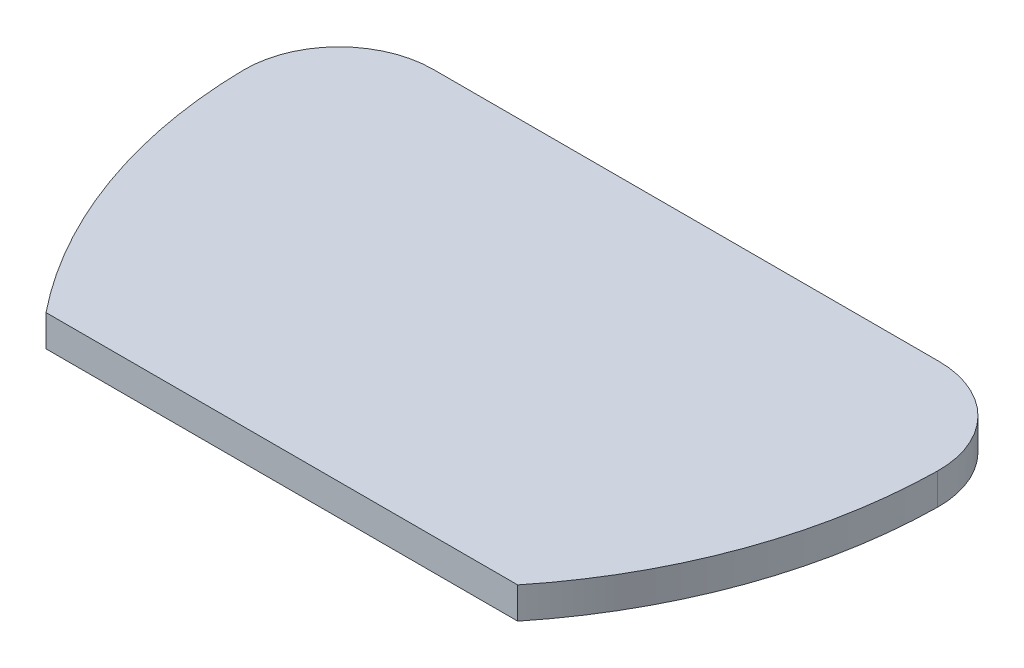
ISO-10303-21;
HEADER;
FILE_DESCRIPTION(('STEP AP214'),'2;1');
FILE_NAME('part.step','',(''),(''),'','','');
FILE_SCHEMA(('AUTOMOTIVE_DESIGN { 1 0 10303 214 1 1 1 1 }'));
ENDSEC;
DATA;
#1=APPLICATION_CONTEXT('core data for automotive mechanical design processes');
#2=APPLICATION_PROTOCOL_DEFINITION('international standard','automotive_design',2000,#1);
#3=PRODUCT_CONTEXT('',#1,'mechanical');
#4=PRODUCT('Part','Part','',(#3));
#5=PRODUCT_RELATED_PRODUCT_CATEGORY('part','',(#4));
#6=PRODUCT_DEFINITION_FORMATION('','',#4);
#7=PRODUCT_DEFINITION_CONTEXT('part definition',#1,'design');
#8=PRODUCT_DEFINITION('design','',#6,#7);
#9=PRODUCT_DEFINITION_SHAPE('','',#8);
#10=(LENGTH_UNIT() NAMED_UNIT(*) SI_UNIT(.MILLI.,.METRE.));
#11=(NAMED_UNIT(*) PLANE_ANGLE_UNIT() SI_UNIT($,.RADIAN.));
#12=(NAMED_UNIT(*) SI_UNIT($,.STERADIAN.) SOLID_ANGLE_UNIT());
#13=UNCERTAINTY_MEASURE_WITH_UNIT(LENGTH_MEASURE(1.E-05),#10,'distance_accuracy_value','');
#14=(GEOMETRIC_REPRESENTATION_CONTEXT(3) GLOBAL_UNCERTAINTY_ASSIGNED_CONTEXT((#13)) GLOBAL_UNIT_ASSIGNED_CONTEXT((#10,
#11,#12)) REPRESENTATION_CONTEXT('',''));
#15=CARTESIAN_POINT('',(0.,0.,0.));
#16=DIRECTION('',(0.,0.,1.));
#17=DIRECTION('',(1.,0.,0.));
#18=AXIS2_PLACEMENT_3D('',#15,#16,#17);
#19=CARTESIAN_POINT('',(31.8297056925963,-6.35,-63.8957190593105));
#20=DIRECTION('',(0.,1.,0.));
#21=DIRECTION('',(0.,0.,1.));
#22=AXIS2_PLACEMENT_3D('',#19,#20,#21);
#23=CYLINDRICAL_SURFACE('',#22,101.986067244144);
#24=CARTESIAN_POINT('',(31.8297056925963,0.,-63.8957190593105));
#25=DIRECTION('',(0.,1.,0.));
#26=DIRECTION('',(0.,0.,-1.));
#27=AXIS2_PLACEMENT_3D('',#24,#25,#26);
#28=CIRCLE('',#27,101.986067244144);
#29=CARTESIAN_POINT('',(-70.1445761151167,0.,-62.3453121036677));
#30=VERTEX_POINT('',#29);
#31=CARTESIAN_POINT('',(-47.6592557915031,0.,0.));
#32=VERTEX_POINT('',#31);
#33=EDGE_CURVE('E116',#30,#32,#28,.T.);
#34=ORIENTED_EDGE('',*,*,#33,.F.);
#35=DIRECTION('',(0.,1.,0.));
#36=VECTOR('',#35,1.);
#37=CARTESIAN_POINT('',(-70.1445761151167,-6.35,-62.3453121036677));
#38=LINE('',#37,#36);
#39=CARTESIAN_POINT('',(-70.1445761151167,-6.35,-62.3453121036677));
#40=VERTEX_POINT('',#39);
#41=EDGE_CURVE('E11',#40,#30,#38,.T.);
#42=ORIENTED_EDGE('',*,*,#41,.F.);
#43=CARTESIAN_POINT('',(31.8297056925963,-6.35,-63.8957190593105));
#44=DIRECTION('',(0.,1.,0.));
#45=DIRECTION('',(0.,0.,-1.));
#46=AXIS2_PLACEMENT_3D('',#43,#44,#45);
#47=CIRCLE('',#46,101.986067244144);
#48=CARTESIAN_POINT('',(-47.6592557915031,-6.35,0.));
#49=VERTEX_POINT('',#48);
#50=EDGE_CURVE('E130',#40,#49,#47,.T.);
#51=ORIENTED_EDGE('',*,*,#50,.T.);
#52=DIRECTION('',(0.,1.,0.));
#53=VECTOR('',#52,1.);
#54=CARTESIAN_POINT('',(-47.6592557915031,-6.35,0.));
#55=LINE('',#54,#53);
#56=EDGE_CURVE('E34',#49,#32,#55,.T.);
#57=ORIENTED_EDGE('',*,*,#56,.T.);
#58=EDGE_LOOP('',(#34,#42,#51,#57));
#59=FACE_BOUND('',#58,.T.);
#60=ADVANCED_FACE('F31',(#59),#23,.T.);
#61=CARTESIAN_POINT('',(-51.0967775193876,-6.35,-62.6349129609524));
#62=DIRECTION('',(0.,1.,0.));
#63=DIRECTION('',(0.,0.,1.));
#64=AXIS2_PLACEMENT_3D('',#61,#62,#63);
#65=CYLINDRICAL_SURFACE('',#64,19.05);
#66=CARTESIAN_POINT('',(-51.0967775193876,0.,-62.6349129609524));
#67=DIRECTION('',(0.,1.,0.));
#68=DIRECTION('',(0.,0.,-1.));
#69=AXIS2_PLACEMENT_3D('',#66,#67,#68);
#70=CIRCLE('',#69,19.05);
#71=CARTESIAN_POINT('',(-51.0967775193876,0.,-81.6849129609524));
#72=VERTEX_POINT('',#71);
#73=EDGE_CURVE('E128',#72,#30,#70,.T.);
#74=ORIENTED_EDGE('',*,*,#73,.F.);
#75=DIRECTION('',(0.,1.,0.));
#76=VECTOR('',#75,1.);
#77=CARTESIAN_POINT('',(-51.0967775193876,-6.35,-81.6849129609524));
#78=LINE('',#77,#76);
#79=CARTESIAN_POINT('',(-51.0967775193876,-6.35,-81.6849129609524));
#80=VERTEX_POINT('',#79);
#81=EDGE_CURVE('E40',#80,#72,#78,.T.);
#82=ORIENTED_EDGE('',*,*,#81,.F.);
#83=CARTESIAN_POINT('',(-51.0967775193876,-6.35,-62.6349129609524));
#84=DIRECTION('',(0.,1.,0.));
#85=DIRECTION('',(0.,0.,-1.));
#86=AXIS2_PLACEMENT_3D('',#83,#84,#85);
#87=CIRCLE('',#86,19.05);
#88=EDGE_CURVE('E106',#80,#40,#87,.T.);
#89=ORIENTED_EDGE('',*,*,#88,.T.);
#90=ORIENTED_EDGE('',*,*,#41,.T.);
#91=EDGE_LOOP('',(#74,#82,#89,#90));
#92=FACE_BOUND('',#91,.T.);
#93=ADVANCED_FACE('F138',(#92),#65,.T.);
#94=CARTESIAN_POINT('',(51.0967775193876,-6.35,-81.6849129609524));
#95=DIRECTION('',(0.,0.,-1.));
#96=DIRECTION('',(-1.,0.,0.));
#97=AXIS2_PLACEMENT_3D('',#94,#95,#96);
#98=PLANE('',#97);
#99=DIRECTION('',(-1.,0.,0.));
#100=VECTOR('',#99,1.);
#101=CARTESIAN_POINT('',(51.0967775193876,0.,-81.6849129609524));
#102=LINE('',#101,#100);
#103=CARTESIAN_POINT('',(51.0967775193876,0.,-81.6849129609524));
#104=VERTEX_POINT('',#103);
#105=EDGE_CURVE('E93',#104,#72,#102,.T.);
#106=ORIENTED_EDGE('',*,*,#105,.F.);
#107=DIRECTION('',(0.,1.,0.));
#108=VECTOR('',#107,1.);
#109=CARTESIAN_POINT('',(51.0967775193876,-6.35,-81.6849129609524));
#110=LINE('',#109,#108);
#111=CARTESIAN_POINT('',(51.0967775193876,-6.35,-81.6849129609524));
#112=VERTEX_POINT('',#111);
#113=EDGE_CURVE('E88',#112,#104,#110,.T.);
#114=ORIENTED_EDGE('',*,*,#113,.F.);
#115=DIRECTION('',(-1.,0.,0.));
#116=VECTOR('',#115,1.);
#117=CARTESIAN_POINT('',(51.0967775193876,-6.35,-81.6849129609524));
#118=LINE('',#117,#116);
#119=EDGE_CURVE('E91',#112,#80,#118,.T.);
#120=ORIENTED_EDGE('',*,*,#119,.T.);
#121=ORIENTED_EDGE('',*,*,#81,.T.);
#122=EDGE_LOOP('',(#106,#114,#120,#121));
#123=FACE_BOUND('',#122,.T.);
#124=ADVANCED_FACE('F90',(#123),#98,.T.);
#125=CARTESIAN_POINT('',(51.0967775193876,-6.35,-62.6349129609524));
#126=DIRECTION('',(0.,1.,0.));
#127=DIRECTION('',(0.,0.,1.));
#128=AXIS2_PLACEMENT_3D('',#125,#126,#127);
#129=CYLINDRICAL_SURFACE('',#128,19.05);
#130=CARTESIAN_POINT('',(51.0967775193876,0.,-62.6349129609524));
#131=DIRECTION('',(0.,1.,0.));
#132=DIRECTION('',(0.,0.,1.));
#133=AXIS2_PLACEMENT_3D('',#130,#131,#132);
#134=CIRCLE('',#133,19.05);
#135=CARTESIAN_POINT('',(70.1445761151167,0.,-62.3453121036677));
#136=VERTEX_POINT('',#135);
#137=EDGE_CURVE('E125',#136,#104,#134,.T.);
#138=ORIENTED_EDGE('',*,*,#137,.F.);
#139=DIRECTION('',(0.,1.,0.));
#140=VECTOR('',#139,1.);
#141=CARTESIAN_POINT('',(70.1445761151167,-6.35,-62.3453121036677));
#142=LINE('',#141,#140);
#143=CARTESIAN_POINT('',(70.1445761151167,-6.35,-62.3453121036677));
#144=VERTEX_POINT('',#143);
#145=EDGE_CURVE('E98',#144,#136,#142,.T.);
#146=ORIENTED_EDGE('',*,*,#145,.F.);
#147=CARTESIAN_POINT('',(51.0967775193876,-6.35,-62.6349129609524));
#148=DIRECTION('',(0.,1.,0.));
#149=DIRECTION('',(0.,0.,1.));
#150=AXIS2_PLACEMENT_3D('',#147,#148,#149);
#151=CIRCLE('',#150,19.05);
#152=EDGE_CURVE('E104',#144,#112,#151,.T.);
#153=ORIENTED_EDGE('',*,*,#152,.T.);
#154=ORIENTED_EDGE('',*,*,#113,.T.);
#155=EDGE_LOOP('',(#138,#146,#153,#154));
#156=FACE_BOUND('',#155,.T.);
#157=ADVANCED_FACE('F108',(#156),#129,.T.);
#158=CARTESIAN_POINT('',(-31.8297056925963,-6.35,-63.8957190593105));
#159=DIRECTION('',(0.,1.,0.));
#160=DIRECTION('',(0.,0.,1.));
#161=AXIS2_PLACEMENT_3D('',#158,#159,#160);
#162=CYLINDRICAL_SURFACE('',#161,101.986067244144);
#163=CARTESIAN_POINT('',(-31.8297056925963,0.,-63.8957190593105));
#164=DIRECTION('',(0.,1.,0.));
#165=DIRECTION('',(0.,0.,1.));
#166=AXIS2_PLACEMENT_3D('',#163,#164,#165);
#167=CIRCLE('',#166,101.986067244144);
#168=CARTESIAN_POINT('',(47.6592557915031,0.,0.));
#169=VERTEX_POINT('',#168);
#170=EDGE_CURVE('E122',#169,#136,#167,.T.);
#171=ORIENTED_EDGE('',*,*,#170,.F.);
#172=DIRECTION('',(0.,1.,0.));
#173=VECTOR('',#172,1.);
#174=CARTESIAN_POINT('',(47.6592557915031,-6.35,0.));
#175=LINE('',#174,#173);
#176=CARTESIAN_POINT('',(47.6592557915031,-6.35,0.));
#177=VERTEX_POINT('',#176);
#178=EDGE_CURVE('E133',#177,#169,#175,.T.);
#179=ORIENTED_EDGE('',*,*,#178,.F.);
#180=CARTESIAN_POINT('',(-31.8297056925963,-6.35,-63.8957190593105));
#181=DIRECTION('',(0.,1.,0.));
#182=DIRECTION('',(0.,0.,1.));
#183=AXIS2_PLACEMENT_3D('',#180,#181,#182);
#184=CIRCLE('',#183,101.986067244144);
#185=EDGE_CURVE('E109',#177,#144,#184,.T.);
#186=ORIENTED_EDGE('',*,*,#185,.T.);
#187=ORIENTED_EDGE('',*,*,#145,.T.);
#188=EDGE_LOOP('',(#171,#179,#186,#187));
#189=FACE_BOUND('',#188,.T.);
#190=ADVANCED_FACE('F151',(#189),#162,.T.);
#191=CARTESIAN_POINT('',(47.6592557915031,-6.35,0.));
#192=DIRECTION('',(0.,0.,1.));
#193=DIRECTION('',(1.,0.,0.));
#194=AXIS2_PLACEMENT_3D('',#191,#192,#193);
#195=PLANE('',#194);
#196=DIRECTION('',(1.,0.,0.));
#197=VECTOR('',#196,1.);
#198=CARTESIAN_POINT('',(47.6592557915031,0.,0.));
#199=LINE('',#198,#197);
#200=EDGE_CURVE('E119',#32,#169,#199,.T.);
#201=ORIENTED_EDGE('',*,*,#200,.F.);
#202=ORIENTED_EDGE('',*,*,#56,.F.);
#203=DIRECTION('',(1.,0.,0.));
#204=VECTOR('',#203,1.);
#205=CARTESIAN_POINT('',(47.6592557915031,-6.35,0.));
#206=LINE('',#205,#204);
#207=EDGE_CURVE('E111',#49,#177,#206,.T.);
#208=ORIENTED_EDGE('',*,*,#207,.T.);
#209=ORIENTED_EDGE('',*,*,#178,.T.);
#210=EDGE_LOOP('',(#201,#202,#208,#209));
#211=FACE_BOUND('',#210,.T.);
#212=ADVANCED_FACE('F135',(#211),#195,.T.);
#213=CARTESIAN_POINT('',(31.8297056925963,-6.35,-63.8957190593105));
#214=DIRECTION('',(0.,-1.,0.));
#215=DIRECTION('',(0.,0.,-1.));
#216=AXIS2_PLACEMENT_3D('',#213,#214,#215);
#217=PLANE('',#216);
#218=ORIENTED_EDGE('',*,*,#50,.F.);
#219=ORIENTED_EDGE('',*,*,#88,.F.);
#220=ORIENTED_EDGE('',*,*,#119,.F.);
#221=ORIENTED_EDGE('',*,*,#152,.F.);
#222=ORIENTED_EDGE('',*,*,#185,.F.);
#223=ORIENTED_EDGE('',*,*,#207,.F.);
#224=EDGE_LOOP('',(#218,#219,#220,#221,#222,#223));
#225=FACE_BOUND('',#224,.T.);
#226=ADVANCED_FACE('F102',(#225),#217,.T.);
#227=CARTESIAN_POINT('',(31.8297056925963,0.,-63.8957190593105));
#228=DIRECTION('',(0.,-1.,0.));
#229=DIRECTION('',(0.,0.,-1.));
#230=AXIS2_PLACEMENT_3D('',#227,#228,#229);
#231=PLANE('',#230);
#232=ORIENTED_EDGE('',*,*,#33,.T.);
#233=ORIENTED_EDGE('',*,*,#200,.T.);
#234=ORIENTED_EDGE('',*,*,#170,.T.);
#235=ORIENTED_EDGE('',*,*,#137,.T.);
#236=ORIENTED_EDGE('',*,*,#105,.T.);
#237=ORIENTED_EDGE('',*,*,#73,.T.);
#238=EDGE_LOOP('',(#232,#233,#234,#235,#236,#237));
#239=FACE_BOUND('',#238,.T.);
#240=ADVANCED_FACE('F137',(#239),#231,.F.);
#241=CLOSED_SHELL('',(#60,#93,#124,#157,#190,#212,#226,#240));
#242=MANIFOLD_SOLID_BREP('B2',#241);
#243=ADVANCED_BREP_SHAPE_REPRESENTATION('',(#18,#242),#14);
#244=SHAPE_DEFINITION_REPRESENTATION(#9,#243);
ENDSEC;
END-ISO-10303-21;
